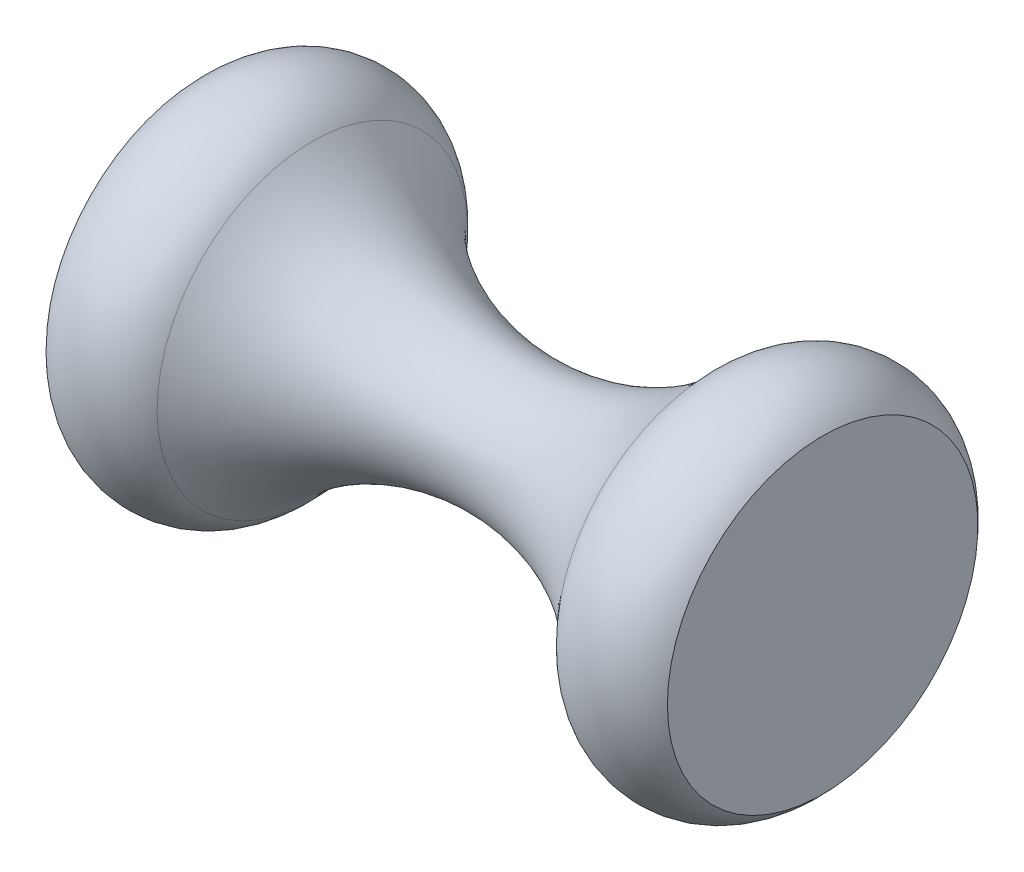
ISO-10303-21;
HEADER;
FILE_DESCRIPTION(('STEP AP214'),'2;1');
FILE_NAME('part.step','',(''),(''),'','','');
FILE_SCHEMA(('AUTOMOTIVE_DESIGN { 1 0 10303 214 1 1 1 1 }'));
ENDSEC;
DATA;
#1=APPLICATION_CONTEXT('core data for automotive mechanical design processes');
#2=APPLICATION_PROTOCOL_DEFINITION('international standard','automotive_design',2000,#1);
#3=PRODUCT_CONTEXT('',#1,'mechanical');
#4=PRODUCT('Part','Part','',(#3));
#5=PRODUCT_RELATED_PRODUCT_CATEGORY('part','',(#4));
#6=PRODUCT_DEFINITION_FORMATION('','',#4);
#7=PRODUCT_DEFINITION_CONTEXT('part definition',#1,'design');
#8=PRODUCT_DEFINITION('design','',#6,#7);
#9=PRODUCT_DEFINITION_SHAPE('','',#8);
#10=(LENGTH_UNIT() NAMED_UNIT(*) SI_UNIT(.MILLI.,.METRE.));
#11=(NAMED_UNIT(*) PLANE_ANGLE_UNIT() SI_UNIT($,.RADIAN.));
#12=(NAMED_UNIT(*) SI_UNIT($,.STERADIAN.) SOLID_ANGLE_UNIT());
#13=UNCERTAINTY_MEASURE_WITH_UNIT(LENGTH_MEASURE(1.E-05),#10,'distance_accuracy_value','');
#14=(GEOMETRIC_REPRESENTATION_CONTEXT(3) GLOBAL_UNCERTAINTY_ASSIGNED_CONTEXT((#13)) GLOBAL_UNIT_ASSIGNED_CONTEXT((#10,
#11,#12)) REPRESENTATION_CONTEXT('',''));
#15=CARTESIAN_POINT('',(0.,0.,0.));
#16=DIRECTION('',(0.,0.,1.));
#17=DIRECTION('',(1.,0.,0.));
#18=AXIS2_PLACEMENT_3D('',#15,#16,#17);
#19=CARTESIAN_POINT('',(-25.,0.,0.));
#20=DIRECTION('',(-1.,0.,0.));
#21=DIRECTION('',(0.,0.,1.));
#22=AXIS2_PLACEMENT_3D('',#19,#20,#21);
#23=PLANE('',#22);
#24=CARTESIAN_POINT('',(-25.,0.,0.));
#25=DIRECTION('',(-1.,0.,0.));
#26=DIRECTION('',(0.,0.,1.));
#27=AXIS2_PLACEMENT_3D('',#24,#25,#26);
#28=CIRCLE('',#27,12.5);
#29=CARTESIAN_POINT('',(-25.,0.,12.5));
#30=VERTEX_POINT('',#29);
#31=EDGE_CURVE('E10',#30,#30,#28,.T.);
#32=ORIENTED_EDGE('',*,*,#31,.T.);
#33=EDGE_LOOP('',(#32));
#34=FACE_BOUND('',#33,.T.);
#35=ADVANCED_FACE('F34',(#34),#23,.T.);
#36=CARTESIAN_POINT('',(-20.5428539710727,0.,0.));
#37=DIRECTION('',(-1.,0.,0.));
#38=DIRECTION('',(0.,0.,1.));
#39=AXIS2_PLACEMENT_3D('',#36,#37,#38);
#40=TOROIDAL_SURFACE('',#39,8.75932090729648,5.81883414420549);
#41=CARTESIAN_POINT('',(-16.0857079421454,0.,0.));
#42=DIRECTION('',(-1.,0.,0.));
#43=DIRECTION('',(0.,0.,1.));
#44=AXIS2_PLACEMENT_3D('',#41,#42,#43);
#45=CIRCLE('',#44,12.5);
#46=CARTESIAN_POINT('',(-16.0857079421454,0.,12.5));
#47=VERTEX_POINT('',#46);
#48=EDGE_CURVE('E40',#47,#47,#45,.T.);
#49=ORIENTED_EDGE('',*,*,#48,.T.);
#50=EDGE_LOOP('',(#49));
#51=FACE_BOUND('',#50,.T.);
#52=ORIENTED_EDGE('',*,*,#31,.F.);
#53=EDGE_LOOP('',(#52));
#54=FACE_BOUND('',#53,.T.);
#55=ADVANCED_FACE('F66',(#51,#54),#40,.T.);
#56=CARTESIAN_POINT('',(0.,0.,0.));
#57=DIRECTION('',(-1.,0.,0.));
#58=DIRECTION('',(0.,0.,1.));
#59=AXIS2_PLACEMENT_3D('',#56,#57,#58);
#60=TOROIDAL_SURFACE('',#59,26.,21.);
#61=CARTESIAN_POINT('',(16.0857079421454,0.,0.));
#62=DIRECTION('',(-1.,0.,0.));
#63=DIRECTION('',(0.,0.,1.));
#64=AXIS2_PLACEMENT_3D('',#61,#62,#63);
#65=CIRCLE('',#64,12.5);
#66=CARTESIAN_POINT('',(16.0857079421454,0.,12.5));
#67=VERTEX_POINT('',#66);
#68=EDGE_CURVE('E44',#67,#67,#65,.T.);
#69=ORIENTED_EDGE('',*,*,#68,.T.);
#70=EDGE_LOOP('',(#69));
#71=FACE_BOUND('',#70,.T.);
#72=ORIENTED_EDGE('',*,*,#48,.F.);
#73=EDGE_LOOP('',(#72));
#74=FACE_BOUND('',#73,.T.);
#75=ADVANCED_FACE('F63',(#71,#74),#60,.F.);
#76=CARTESIAN_POINT('',(20.5428539710727,0.,0.));
#77=DIRECTION('',(-1.,0.,0.));
#78=DIRECTION('',(0.,0.,1.));
#79=AXIS2_PLACEMENT_3D('',#76,#77,#78);
#80=TOROIDAL_SURFACE('',#79,8.75932090729648,5.81883414420549);
#81=CARTESIAN_POINT('',(25.,0.,0.));
#82=DIRECTION('',(-1.,0.,0.));
#83=DIRECTION('',(0.,0.,1.));
#84=AXIS2_PLACEMENT_3D('',#81,#82,#83);
#85=CIRCLE('',#84,12.5);
#86=CARTESIAN_POINT('',(25.,0.,12.5));
#87=VERTEX_POINT('',#86);
#88=EDGE_CURVE('E48',#87,#87,#85,.T.);
#89=ORIENTED_EDGE('',*,*,#88,.T.);
#90=EDGE_LOOP('',(#89));
#91=FACE_BOUND('',#90,.T.);
#92=ORIENTED_EDGE('',*,*,#68,.F.);
#93=EDGE_LOOP('',(#92));
#94=FACE_BOUND('',#93,.T.);
#95=ADVANCED_FACE('F54',(#91,#94),#80,.T.);
#96=CARTESIAN_POINT('',(25.,0.,0.));
#97=DIRECTION('',(1.,0.,0.));
#98=DIRECTION('',(0.,0.,-1.));
#99=AXIS2_PLACEMENT_3D('',#96,#97,#98);
#100=PLANE('',#99);
#101=ORIENTED_EDGE('',*,*,#88,.F.);
#102=EDGE_LOOP('',(#101));
#103=FACE_BOUND('',#102,.T.);
#104=ADVANCED_FACE('F57',(#103),#100,.T.);
#105=CLOSED_SHELL('',(#35,#55,#75,#95,#104));
#106=MANIFOLD_SOLID_BREP('B2',#105);
#107=ADVANCED_BREP_SHAPE_REPRESENTATION('',(#18,#106),#14);
#108=SHAPE_DEFINITION_REPRESENTATION(#9,#107);
ENDSEC;
END-ISO-10303-21;
